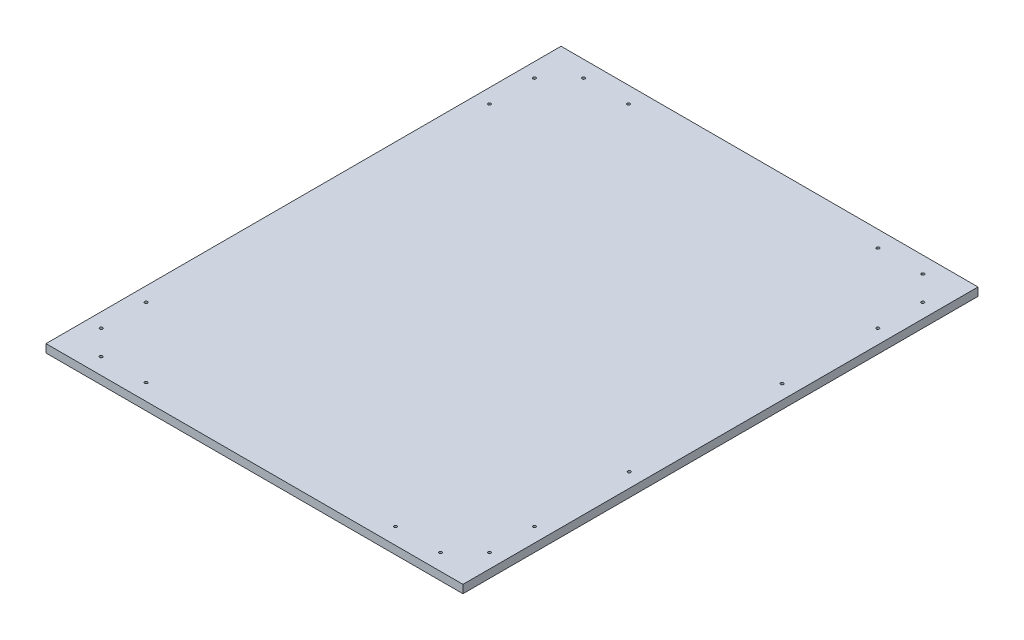
ISO-10303-21;
HEADER;
FILE_DESCRIPTION(('STEP AP214'),'2;1');
FILE_NAME('part.step','',(''),(''),'','','');
FILE_SCHEMA(('AUTOMOTIVE_DESIGN { 1 0 10303 214 1 1 1 1 }'));
ENDSEC;
DATA;
#1=APPLICATION_CONTEXT('core data for automotive mechanical design processes');
#2=APPLICATION_PROTOCOL_DEFINITION('international standard','automotive_design',2000,#1);
#3=PRODUCT_CONTEXT('',#1,'mechanical');
#4=PRODUCT('Part','Part','',(#3));
#5=PRODUCT_RELATED_PRODUCT_CATEGORY('part','',(#4));
#6=PRODUCT_DEFINITION_FORMATION('','',#4);
#7=PRODUCT_DEFINITION_CONTEXT('part definition',#1,'design');
#8=PRODUCT_DEFINITION('design','',#6,#7);
#9=PRODUCT_DEFINITION_SHAPE('','',#8);
#10=(LENGTH_UNIT() NAMED_UNIT(*) SI_UNIT(.MILLI.,.METRE.));
#11=(NAMED_UNIT(*) PLANE_ANGLE_UNIT() SI_UNIT($,.RADIAN.));
#12=(NAMED_UNIT(*) SI_UNIT($,.STERADIAN.) SOLID_ANGLE_UNIT());
#13=UNCERTAINTY_MEASURE_WITH_UNIT(LENGTH_MEASURE(1.E-05),#10,'distance_accuracy_value','');
#14=(GEOMETRIC_REPRESENTATION_CONTEXT(3) GLOBAL_UNCERTAINTY_ASSIGNED_CONTEXT((#13)) GLOBAL_UNIT_ASSIGNED_CONTEXT((#10,
#11,#12)) REPRESENTATION_CONTEXT('',''));
#15=CARTESIAN_POINT('',(0.,0.,0.));
#16=DIRECTION('',(0.,0.,1.));
#17=DIRECTION('',(1.,0.,0.));
#18=AXIS2_PLACEMENT_3D('',#15,#16,#17);
#19=CARTESIAN_POINT('',(0.,10.,0.));
#20=DIRECTION('',(0.,0.,-1.));
#21=DIRECTION('',(-1.,0.,0.));
#22=AXIS2_PLACEMENT_3D('',#19,#20,#21);
#23=PLANE('',#22);
#24=DIRECTION('',(1.,0.,0.));
#25=VECTOR('',#24,1.);
#26=CARTESIAN_POINT('',(0.,0.,0.));
#27=LINE('',#26,#25);
#28=CARTESIAN_POINT('',(0.,0.,0.));
#29=VERTEX_POINT('',#28);
#30=CARTESIAN_POINT('',(510.,0.,0.));
#31=VERTEX_POINT('',#30);
#32=EDGE_CURVE('E116',#29,#31,#27,.T.);
#33=ORIENTED_EDGE('',*,*,#32,.T.);
#34=DIRECTION('',(0.,-1.,0.));
#35=VECTOR('',#34,1.);
#36=CARTESIAN_POINT('',(510.,10.,0.));
#37=LINE('',#36,#35);
#38=CARTESIAN_POINT('',(510.,10.,0.));
#39=VERTEX_POINT('',#38);
#40=EDGE_CURVE('E11',#39,#31,#37,.T.);
#41=ORIENTED_EDGE('',*,*,#40,.F.);
#42=DIRECTION('',(1.,0.,0.));
#43=VECTOR('',#42,1.);
#44=CARTESIAN_POINT('',(0.,10.,0.));
#45=LINE('',#44,#43);
#46=CARTESIAN_POINT('',(0.,10.,0.));
#47=VERTEX_POINT('',#46);
#48=EDGE_CURVE('E99',#47,#39,#45,.T.);
#49=ORIENTED_EDGE('',*,*,#48,.F.);
#50=DIRECTION('',(0.,-1.,0.));
#51=VECTOR('',#50,1.);
#52=CARTESIAN_POINT('',(0.,10.,0.));
#53=LINE('',#52,#51);
#54=EDGE_CURVE('E112',#47,#29,#53,.T.);
#55=ORIENTED_EDGE('',*,*,#54,.T.);
#56=EDGE_LOOP('',(#33,#41,#49,#55));
#57=FACE_BOUND('',#56,.T.);
#58=ADVANCED_FACE('F45',(#57),#23,.F.);
#59=CARTESIAN_POINT('',(510.,10.,0.));
#60=DIRECTION('',(-1.,0.,0.));
#61=DIRECTION('',(0.,0.,1.));
#62=AXIS2_PLACEMENT_3D('',#59,#60,#61);
#63=PLANE('',#62);
#64=DIRECTION('',(0.,0.,-1.));
#65=VECTOR('',#64,1.);
#66=CARTESIAN_POINT('',(510.,0.,0.));
#67=LINE('',#66,#65);
#68=CARTESIAN_POINT('',(510.,0.,-630.));
#69=VERTEX_POINT('',#68);
#70=EDGE_CURVE('E104',#31,#69,#67,.T.);
#71=ORIENTED_EDGE('',*,*,#70,.T.);
#72=DIRECTION('',(0.,-1.,0.));
#73=VECTOR('',#72,1.);
#74=CARTESIAN_POINT('',(510.,10.,-630.));
#75=LINE('',#74,#73);
#76=CARTESIAN_POINT('',(510.,10.,-630.));
#77=VERTEX_POINT('',#76);
#78=EDGE_CURVE('E55',#77,#69,#75,.T.);
#79=ORIENTED_EDGE('',*,*,#78,.F.);
#80=DIRECTION('',(0.,0.,-1.));
#81=VECTOR('',#80,1.);
#82=CARTESIAN_POINT('',(510.,10.,0.));
#83=LINE('',#82,#81);
#84=EDGE_CURVE('E94',#39,#77,#83,.T.);
#85=ORIENTED_EDGE('',*,*,#84,.F.);
#86=ORIENTED_EDGE('',*,*,#40,.T.);
#87=EDGE_LOOP('',(#71,#79,#85,#86));
#88=FACE_BOUND('',#87,.T.);
#89=ADVANCED_FACE('F103',(#88),#63,.F.);
#90=CARTESIAN_POINT('',(510.,10.,-630.));
#91=DIRECTION('',(0.,0.,1.));
#92=DIRECTION('',(1.,0.,0.));
#93=AXIS2_PLACEMENT_3D('',#90,#91,#92);
#94=PLANE('',#93);
#95=DIRECTION('',(-1.,0.,0.));
#96=VECTOR('',#95,1.);
#97=CARTESIAN_POINT('',(510.,0.,-630.));
#98=LINE('',#97,#96);
#99=CARTESIAN_POINT('',(0.,0.,-630.));
#100=VERTEX_POINT('',#99);
#101=EDGE_CURVE('E81',#69,#100,#98,.T.);
#102=ORIENTED_EDGE('',*,*,#101,.T.);
#103=DIRECTION('',(0.,-1.,0.));
#104=VECTOR('',#103,1.);
#105=CARTESIAN_POINT('',(0.,10.,-630.));
#106=LINE('',#105,#104);
#107=CARTESIAN_POINT('',(0.,10.,-630.));
#108=VERTEX_POINT('',#107);
#109=EDGE_CURVE('E106',#108,#100,#106,.T.);
#110=ORIENTED_EDGE('',*,*,#109,.F.);
#111=DIRECTION('',(-1.,0.,0.));
#112=VECTOR('',#111,1.);
#113=CARTESIAN_POINT('',(510.,10.,-630.));
#114=LINE('',#113,#112);
#115=EDGE_CURVE('E97',#77,#108,#114,.T.);
#116=ORIENTED_EDGE('',*,*,#115,.F.);
#117=ORIENTED_EDGE('',*,*,#78,.T.);
#118=EDGE_LOOP('',(#102,#110,#116,#117));
#119=FACE_BOUND('',#118,.T.);
#120=ADVANCED_FACE('F108',(#119),#94,.F.);
#121=CARTESIAN_POINT('',(0.,10.,0.));
#122=DIRECTION('',(1.,0.,0.));
#123=DIRECTION('',(0.,0.,-1.));
#124=AXIS2_PLACEMENT_3D('',#121,#122,#123);
#125=PLANE('',#124);
#126=DIRECTION('',(0.,0.,1.));
#127=VECTOR('',#126,1.);
#128=CARTESIAN_POINT('',(0.,0.,0.));
#129=LINE('',#128,#127);
#130=EDGE_CURVE('E87',#100,#29,#129,.T.);
#131=ORIENTED_EDGE('',*,*,#130,.T.);
#132=ORIENTED_EDGE('',*,*,#54,.F.);
#133=DIRECTION('',(0.,0.,1.));
#134=VECTOR('',#133,1.);
#135=CARTESIAN_POINT('',(0.,10.,0.));
#136=LINE('',#135,#134);
#137=EDGE_CURVE('E64',#108,#47,#136,.T.);
#138=ORIENTED_EDGE('',*,*,#137,.F.);
#139=ORIENTED_EDGE('',*,*,#109,.T.);
#140=EDGE_LOOP('',(#131,#132,#138,#139));
#141=FACE_BOUND('',#140,.T.);
#142=ADVANCED_FACE('F287',(#141),#125,.F.);
#143=CARTESIAN_POINT('',(0.,10.,0.));
#144=DIRECTION('',(0.,1.,0.));
#145=DIRECTION('',(0.,0.,1.));
#146=AXIS2_PLACEMENT_3D('',#143,#144,#145);
#147=PLANE('',#146);
#148=CARTESIAN_POINT('',(102.5,10.,-610.));
#149=DIRECTION('',(0.,1.,0.));
#150=DIRECTION('',(0.,0.,1.));
#151=AXIS2_PLACEMENT_3D('',#148,#149,#150);
#152=CIRCLE('',#151,1.8);
#153=CARTESIAN_POINT('',(102.5,10.,-608.2));
#154=VERTEX_POINT('',#153);
#155=EDGE_CURVE('E252',#154,#154,#152,.T.);
#156=ORIENTED_EDGE('',*,*,#155,.F.);
#157=EDGE_LOOP('',(#156));
#158=FACE_BOUND('',#157,.T.);
#159=CARTESIAN_POINT('',(407.5,10.,-610.));
#160=DIRECTION('',(0.,1.,0.));
#161=DIRECTION('',(0.,0.,1.));
#162=AXIS2_PLACEMENT_3D('',#159,#160,#161);
#163=CIRCLE('',#162,1.80000000000001);
#164=CARTESIAN_POINT('',(407.5,10.,-608.2));
#165=VERTEX_POINT('',#164);
#166=EDGE_CURVE('E262',#165,#165,#163,.T.);
#167=ORIENTED_EDGE('',*,*,#166,.F.);
#168=EDGE_LOOP('',(#167));
#169=FACE_BOUND('',#168,.T.);
#170=CARTESIAN_POINT('',(462.5,10.,-610.));
#171=DIRECTION('',(0.,1.,0.));
#172=DIRECTION('',(0.,0.,1.));
#173=AXIS2_PLACEMENT_3D('',#170,#171,#172);
#174=CIRCLE('',#173,1.80000000000001);
#175=CARTESIAN_POINT('',(462.5,10.,-608.2));
#176=VERTEX_POINT('',#175);
#177=EDGE_CURVE('E257',#176,#176,#174,.T.);
#178=ORIENTED_EDGE('',*,*,#177,.F.);
#179=EDGE_LOOP('',(#178));
#180=FACE_BOUND('',#179,.T.);
#181=CARTESIAN_POINT('',(462.5,10.,-20.));
#182=DIRECTION('',(0.,1.,0.));
#183=DIRECTION('',(0.,0.,1.));
#184=AXIS2_PLACEMENT_3D('',#181,#182,#183);
#185=CIRCLE('',#184,1.80000000000001);
#186=CARTESIAN_POINT('',(462.5,10.,-18.2));
#187=VERTEX_POINT('',#186);
#188=EDGE_CURVE('E253',#187,#187,#185,.T.);
#189=ORIENTED_EDGE('',*,*,#188,.F.);
#190=EDGE_LOOP('',(#189));
#191=FACE_BOUND('',#190,.T.);
#192=CARTESIAN_POINT('',(407.5,10.,-20.));
#193=DIRECTION('',(0.,1.,0.));
#194=DIRECTION('',(0.,0.,1.));
#195=AXIS2_PLACEMENT_3D('',#192,#193,#194);
#196=CIRCLE('',#195,1.80000000000001);
#197=CARTESIAN_POINT('',(407.5,10.,-18.2));
#198=VERTEX_POINT('',#197);
#199=EDGE_CURVE('E258',#198,#198,#196,.T.);
#200=ORIENTED_EDGE('',*,*,#199,.F.);
#201=EDGE_LOOP('',(#200));
#202=FACE_BOUND('',#201,.T.);
#203=CARTESIAN_POINT('',(102.5,10.,-20.));
#204=DIRECTION('',(0.,1.,0.));
#205=DIRECTION('',(0.,0.,1.));
#206=AXIS2_PLACEMENT_3D('',#203,#204,#205);
#207=CIRCLE('',#206,1.79999999999999);
#208=CARTESIAN_POINT('',(102.5,10.,-18.2));
#209=VERTEX_POINT('',#208);
#210=EDGE_CURVE('E273',#209,#209,#207,.T.);
#211=ORIENTED_EDGE('',*,*,#210,.F.);
#212=EDGE_LOOP('',(#211));
#213=FACE_BOUND('',#212,.T.);
#214=CARTESIAN_POINT('',(47.5,10.,-20.));
#215=DIRECTION('',(0.,1.,0.));
#216=DIRECTION('',(0.,0.,1.));
#217=AXIS2_PLACEMENT_3D('',#214,#215,#216);
#218=CIRCLE('',#217,1.79999999999999);
#219=CARTESIAN_POINT('',(47.5,10.,-18.2));
#220=VERTEX_POINT('',#219);
#221=EDGE_CURVE('E269',#220,#220,#218,.T.);
#222=ORIENTED_EDGE('',*,*,#221,.F.);
#223=EDGE_LOOP('',(#222));
#224=FACE_BOUND('',#223,.T.);
#225=CARTESIAN_POINT('',(47.5,10.,-610.));
#226=DIRECTION('',(0.,1.,0.));
#227=DIRECTION('',(0.,0.,1.));
#228=AXIS2_PLACEMENT_3D('',#225,#226,#227);
#229=CIRCLE('',#228,1.8);
#230=CARTESIAN_POINT('',(47.5,10.,-608.2));
#231=VERTEX_POINT('',#230);
#232=EDGE_CURVE('E136',#231,#231,#229,.T.);
#233=ORIENTED_EDGE('',*,*,#232,.F.);
#234=EDGE_LOOP('',(#233));
#235=FACE_BOUND('',#234,.T.);
#236=CARTESIAN_POINT('',(17.5,10.,-50.));
#237=DIRECTION('',(0.,1.,0.));
#238=DIRECTION('',(0.,0.,1.));
#239=AXIS2_PLACEMENT_3D('',#236,#237,#238);
#240=CIRCLE('',#239,1.8);
#241=CARTESIAN_POINT('',(17.5,10.,-48.2));
#242=VERTEX_POINT('',#241);
#243=EDGE_CURVE('E228',#242,#242,#240,.T.);
#244=ORIENTED_EDGE('',*,*,#243,.F.);
#245=EDGE_LOOP('',(#244));
#246=FACE_BOUND('',#245,.T.);
#247=CARTESIAN_POINT('',(17.5,10.,-105.));
#248=DIRECTION('',(0.,1.,0.));
#249=DIRECTION('',(0.,0.,1.));
#250=AXIS2_PLACEMENT_3D('',#247,#248,#249);
#251=CIRCLE('',#250,1.8);
#252=CARTESIAN_POINT('',(17.5,10.,-103.2));
#253=VERTEX_POINT('',#252);
#254=EDGE_CURVE('E232',#253,#253,#251,.T.);
#255=ORIENTED_EDGE('',*,*,#254,.F.);
#256=EDGE_LOOP('',(#255));
#257=FACE_BOUND('',#256,.T.);
#258=CARTESIAN_POINT('',(17.5,10.,-525.));
#259=DIRECTION('',(0.,1.,0.));
#260=DIRECTION('',(0.,0.,1.));
#261=AXIS2_PLACEMENT_3D('',#258,#259,#260);
#262=CIRCLE('',#261,1.80000000000002);
#263=CARTESIAN_POINT('',(17.5,10.,-523.2));
#264=VERTEX_POINT('',#263);
#265=EDGE_CURVE('E240',#264,#264,#262,.T.);
#266=ORIENTED_EDGE('',*,*,#265,.F.);
#267=EDGE_LOOP('',(#266));
#268=FACE_BOUND('',#267,.T.);
#269=CARTESIAN_POINT('',(17.5,10.,-580.));
#270=DIRECTION('',(0.,1.,0.));
#271=DIRECTION('',(0.,0.,1.));
#272=AXIS2_PLACEMENT_3D('',#269,#270,#271);
#273=CIRCLE('',#272,1.80000000000001);
#274=CARTESIAN_POINT('',(17.5,10.,-578.2));
#275=VERTEX_POINT('',#274);
#276=EDGE_CURVE('E167',#275,#275,#273,.T.);
#277=ORIENTED_EDGE('',*,*,#276,.F.);
#278=EDGE_LOOP('',(#277));
#279=FACE_BOUND('',#278,.T.);
#280=CARTESIAN_POINT('',(492.5,10.,-50.));
#281=DIRECTION('',(0.,1.,0.));
#282=DIRECTION('',(0.,0.,1.));
#283=AXIS2_PLACEMENT_3D('',#280,#281,#282);
#284=CIRCLE('',#283,1.80000000000001);
#285=CARTESIAN_POINT('',(492.5,10.,-48.2));
#286=VERTEX_POINT('',#285);
#287=EDGE_CURVE('E180',#286,#286,#284,.T.);
#288=ORIENTED_EDGE('',*,*,#287,.F.);
#289=EDGE_LOOP('',(#288));
#290=FACE_BOUND('',#289,.T.);
#291=CARTESIAN_POINT('',(492.5,10.,-221.));
#292=DIRECTION('',(0.,1.,0.));
#293=DIRECTION('',(0.,0.,1.));
#294=AXIS2_PLACEMENT_3D('',#291,#292,#293);
#295=CIRCLE('',#294,1.80000000000001);
#296=CARTESIAN_POINT('',(492.5,10.,-219.2));
#297=VERTEX_POINT('',#296);
#298=EDGE_CURVE('E185',#297,#297,#295,.T.);
#299=ORIENTED_EDGE('',*,*,#298,.F.);
#300=EDGE_LOOP('',(#299));
#301=FACE_BOUND('',#300,.T.);
#302=CARTESIAN_POINT('',(492.5,10.,-105.));
#303=DIRECTION('',(0.,1.,0.));
#304=DIRECTION('',(0.,0.,1.));
#305=AXIS2_PLACEMENT_3D('',#302,#303,#304);
#306=CIRCLE('',#305,1.80000000000001);
#307=CARTESIAN_POINT('',(492.5,10.,-103.2));
#308=VERTEX_POINT('',#307);
#309=EDGE_CURVE('E184',#308,#308,#306,.T.);
#310=ORIENTED_EDGE('',*,*,#309,.F.);
#311=EDGE_LOOP('',(#310));
#312=FACE_BOUND('',#311,.T.);
#313=CARTESIAN_POINT('',(492.5,10.,-580.));
#314=DIRECTION('',(0.,1.,0.));
#315=DIRECTION('',(0.,0.,1.));
#316=AXIS2_PLACEMENT_3D('',#313,#314,#315);
#317=CIRCLE('',#316,1.80000000000001);
#318=CARTESIAN_POINT('',(492.5,10.,-578.2));
#319=VERTEX_POINT('',#318);
#320=EDGE_CURVE('E218',#319,#319,#317,.T.);
#321=ORIENTED_EDGE('',*,*,#320,.F.);
#322=EDGE_LOOP('',(#321));
#323=FACE_BOUND('',#322,.T.);
#324=CARTESIAN_POINT('',(492.5,10.,-525.));
#325=DIRECTION('',(0.,1.,0.));
#326=DIRECTION('',(0.,0.,1.));
#327=AXIS2_PLACEMENT_3D('',#324,#325,#326);
#328=CIRCLE('',#327,1.80000000000001);
#329=CARTESIAN_POINT('',(492.5,10.,-523.2));
#330=VERTEX_POINT('',#329);
#331=EDGE_CURVE('E195',#330,#330,#328,.T.);
#332=ORIENTED_EDGE('',*,*,#331,.F.);
#333=EDGE_LOOP('',(#332));
#334=FACE_BOUND('',#333,.T.);
#335=CARTESIAN_POINT('',(492.5,10.,-407.828802921746));
#336=DIRECTION('',(0.,1.,0.));
#337=DIRECTION('',(0.,0.,1.));
#338=AXIS2_PLACEMENT_3D('',#335,#336,#337);
#339=CIRCLE('',#338,1.80000000000001);
#340=CARTESIAN_POINT('',(492.5,10.,-406.028802921746));
#341=VERTEX_POINT('',#340);
#342=EDGE_CURVE('E204',#341,#341,#339,.T.);
#343=ORIENTED_EDGE('',*,*,#342,.F.);
#344=EDGE_LOOP('',(#343));
#345=FACE_BOUND('',#344,.T.);
#346=ORIENTED_EDGE('',*,*,#48,.T.);
#347=ORIENTED_EDGE('',*,*,#84,.T.);
#348=ORIENTED_EDGE('',*,*,#115,.T.);
#349=ORIENTED_EDGE('',*,*,#137,.T.);
#350=EDGE_LOOP('',(#346,#347,#348,#349));
#351=FACE_BOUND('',#350,.T.);
#352=ADVANCED_FACE('F95',(#158,#169,#180,#191,#202,#213,#224,#235,#246,#257,#268,#279,#290,#301,
#312,#323,#334,#345,#351),#147,.T.);
#353=CARTESIAN_POINT('',(0.,0.,0.));
#354=DIRECTION('',(0.,1.,0.));
#355=DIRECTION('',(0.,0.,1.));
#356=AXIS2_PLACEMENT_3D('',#353,#354,#355);
#357=PLANE('',#356);
#358=CARTESIAN_POINT('',(102.5,0.,-610.));
#359=DIRECTION('',(0.,1.,0.));
#360=DIRECTION('',(0.,0.,1.));
#361=AXIS2_PLACEMENT_3D('',#358,#359,#360);
#362=CIRCLE('',#361,1.8);
#363=CARTESIAN_POINT('',(102.5,0.,-608.2));
#364=VERTEX_POINT('',#363);
#365=EDGE_CURVE('E48',#364,#364,#362,.T.);
#366=ORIENTED_EDGE('',*,*,#365,.T.);
#367=EDGE_LOOP('',(#366));
#368=FACE_BOUND('',#367,.T.);
#369=CARTESIAN_POINT('',(407.5,0.,-610.));
#370=DIRECTION('',(0.,1.,0.));
#371=DIRECTION('',(0.,0.,1.));
#372=AXIS2_PLACEMENT_3D('',#369,#370,#371);
#373=CIRCLE('',#372,1.80000000000001);
#374=CARTESIAN_POINT('',(407.5,0.,-608.2));
#375=VERTEX_POINT('',#374);
#376=EDGE_CURVE('E155',#375,#375,#373,.T.);
#377=ORIENTED_EDGE('',*,*,#376,.T.);
#378=EDGE_LOOP('',(#377));
#379=FACE_BOUND('',#378,.T.);
#380=CARTESIAN_POINT('',(462.5,0.,-610.));
#381=DIRECTION('',(0.,1.,0.));
#382=DIRECTION('',(0.,0.,1.));
#383=AXIS2_PLACEMENT_3D('',#380,#381,#382);
#384=CIRCLE('',#383,1.80000000000001);
#385=CARTESIAN_POINT('',(462.5,0.,-608.2));
#386=VERTEX_POINT('',#385);
#387=EDGE_CURVE('E152',#386,#386,#384,.T.);
#388=ORIENTED_EDGE('',*,*,#387,.T.);
#389=EDGE_LOOP('',(#388));
#390=FACE_BOUND('',#389,.T.);
#391=CARTESIAN_POINT('',(462.5,0.,-20.));
#392=DIRECTION('',(0.,1.,0.));
#393=DIRECTION('',(0.,0.,1.));
#394=AXIS2_PLACEMENT_3D('',#391,#392,#393);
#395=CIRCLE('',#394,1.80000000000001);
#396=CARTESIAN_POINT('',(462.5,0.,-18.2));
#397=VERTEX_POINT('',#396);
#398=EDGE_CURVE('E148',#397,#397,#395,.T.);
#399=ORIENTED_EDGE('',*,*,#398,.T.);
#400=EDGE_LOOP('',(#399));
#401=FACE_BOUND('',#400,.T.);
#402=CARTESIAN_POINT('',(407.5,0.,-20.));
#403=DIRECTION('',(0.,1.,0.));
#404=DIRECTION('',(0.,0.,1.));
#405=AXIS2_PLACEMENT_3D('',#402,#403,#404);
#406=CIRCLE('',#405,1.80000000000001);
#407=CARTESIAN_POINT('',(407.5,0.,-18.2));
#408=VERTEX_POINT('',#407);
#409=EDGE_CURVE('E144',#408,#408,#406,.T.);
#410=ORIENTED_EDGE('',*,*,#409,.T.);
#411=EDGE_LOOP('',(#410));
#412=FACE_BOUND('',#411,.T.);
#413=CARTESIAN_POINT('',(102.5,0.,-20.));
#414=DIRECTION('',(0.,1.,0.));
#415=DIRECTION('',(0.,0.,1.));
#416=AXIS2_PLACEMENT_3D('',#413,#414,#415);
#417=CIRCLE('',#416,1.79999999999999);
#418=CARTESIAN_POINT('',(102.5,0.,-18.2));
#419=VERTEX_POINT('',#418);
#420=EDGE_CURVE('E140',#419,#419,#417,.T.);
#421=ORIENTED_EDGE('',*,*,#420,.T.);
#422=EDGE_LOOP('',(#421));
#423=FACE_BOUND('',#422,.T.);
#424=CARTESIAN_POINT('',(47.5,0.,-20.));
#425=DIRECTION('',(0.,1.,0.));
#426=DIRECTION('',(0.,0.,1.));
#427=AXIS2_PLACEMENT_3D('',#424,#425,#426);
#428=CIRCLE('',#427,1.79999999999999);
#429=CARTESIAN_POINT('',(47.5,0.,-18.2));
#430=VERTEX_POINT('',#429);
#431=EDGE_CURVE('E135',#430,#430,#428,.T.);
#432=ORIENTED_EDGE('',*,*,#431,.T.);
#433=EDGE_LOOP('',(#432));
#434=FACE_BOUND('',#433,.T.);
#435=CARTESIAN_POINT('',(47.5,0.,-610.));
#436=DIRECTION('',(0.,1.,0.));
#437=DIRECTION('',(0.,0.,1.));
#438=AXIS2_PLACEMENT_3D('',#435,#436,#437);
#439=CIRCLE('',#438,1.8);
#440=CARTESIAN_POINT('',(47.5,0.,-608.2));
#441=VERTEX_POINT('',#440);
#442=EDGE_CURVE('E131',#441,#441,#439,.T.);
#443=ORIENTED_EDGE('',*,*,#442,.T.);
#444=EDGE_LOOP('',(#443));
#445=FACE_BOUND('',#444,.T.);
#446=CARTESIAN_POINT('',(17.5,0.,-50.));
#447=DIRECTION('',(0.,1.,0.));
#448=DIRECTION('',(0.,0.,1.));
#449=AXIS2_PLACEMENT_3D('',#446,#447,#448);
#450=CIRCLE('',#449,1.8);
#451=CARTESIAN_POINT('',(17.5,0.,-48.2));
#452=VERTEX_POINT('',#451);
#453=EDGE_CURVE('E194',#452,#452,#450,.T.);
#454=ORIENTED_EDGE('',*,*,#453,.T.);
#455=EDGE_LOOP('',(#454));
#456=FACE_BOUND('',#455,.T.);
#457=CARTESIAN_POINT('',(17.5,0.,-105.));
#458=DIRECTION('',(0.,1.,0.));
#459=DIRECTION('',(0.,0.,1.));
#460=AXIS2_PLACEMENT_3D('',#457,#458,#459);
#461=CIRCLE('',#460,1.8);
#462=CARTESIAN_POINT('',(17.5,0.,-103.2));
#463=VERTEX_POINT('',#462);
#464=EDGE_CURVE('E236',#463,#463,#461,.T.);
#465=ORIENTED_EDGE('',*,*,#464,.T.);
#466=EDGE_LOOP('',(#465));
#467=FACE_BOUND('',#466,.T.);
#468=CARTESIAN_POINT('',(17.5,0.,-525.));
#469=DIRECTION('',(0.,1.,0.));
#470=DIRECTION('',(0.,0.,1.));
#471=AXIS2_PLACEMENT_3D('',#468,#469,#470);
#472=CIRCLE('',#471,1.80000000000002);
#473=CARTESIAN_POINT('',(17.5,0.,-523.2));
#474=VERTEX_POINT('',#473);
#475=EDGE_CURVE('E173',#474,#474,#472,.T.);
#476=ORIENTED_EDGE('',*,*,#475,.T.);
#477=EDGE_LOOP('',(#476));
#478=FACE_BOUND('',#477,.T.);
#479=CARTESIAN_POINT('',(17.5,0.,-580.));
#480=DIRECTION('',(0.,1.,0.));
#481=DIRECTION('',(0.,0.,1.));
#482=AXIS2_PLACEMENT_3D('',#479,#480,#481);
#483=CIRCLE('',#482,1.80000000000001);
#484=CARTESIAN_POINT('',(17.5,0.,-578.2));
#485=VERTEX_POINT('',#484);
#486=EDGE_CURVE('E162',#485,#485,#483,.T.);
#487=ORIENTED_EDGE('',*,*,#486,.T.);
#488=EDGE_LOOP('',(#487));
#489=FACE_BOUND('',#488,.T.);
#490=CARTESIAN_POINT('',(492.5,0.,-50.));
#491=DIRECTION('',(0.,1.,0.));
#492=DIRECTION('',(0.,0.,1.));
#493=AXIS2_PLACEMENT_3D('',#490,#491,#492);
#494=CIRCLE('',#493,1.80000000000001);
#495=CARTESIAN_POINT('',(492.5,0.,-48.2));
#496=VERTEX_POINT('',#495);
#497=EDGE_CURVE('E120',#496,#496,#494,.T.);
#498=ORIENTED_EDGE('',*,*,#497,.T.);
#499=EDGE_LOOP('',(#498));
#500=FACE_BOUND('',#499,.T.);
#501=CARTESIAN_POINT('',(492.5,0.,-221.));
#502=DIRECTION('',(0.,1.,0.));
#503=DIRECTION('',(0.,0.,1.));
#504=AXIS2_PLACEMENT_3D('',#501,#502,#503);
#505=CIRCLE('',#504,1.80000000000001);
#506=CARTESIAN_POINT('',(492.5,0.,-219.2));
#507=VERTEX_POINT('',#506);
#508=EDGE_CURVE('E190',#507,#507,#505,.T.);
#509=ORIENTED_EDGE('',*,*,#508,.T.);
#510=EDGE_LOOP('',(#509));
#511=FACE_BOUND('',#510,.T.);
#512=CARTESIAN_POINT('',(492.5,0.,-105.));
#513=DIRECTION('',(0.,1.,0.));
#514=DIRECTION('',(0.,0.,1.));
#515=AXIS2_PLACEMENT_3D('',#512,#513,#514);
#516=CIRCLE('',#515,1.80000000000001);
#517=CARTESIAN_POINT('',(492.5,0.,-103.2));
#518=VERTEX_POINT('',#517);
#519=EDGE_CURVE('E214',#518,#518,#516,.T.);
#520=ORIENTED_EDGE('',*,*,#519,.T.);
#521=EDGE_LOOP('',(#520));
#522=FACE_BOUND('',#521,.T.);
#523=CARTESIAN_POINT('',(492.5,0.,-580.));
#524=DIRECTION('',(0.,1.,0.));
#525=DIRECTION('',(0.,0.,1.));
#526=AXIS2_PLACEMENT_3D('',#523,#524,#525);
#527=CIRCLE('',#526,1.80000000000001);
#528=CARTESIAN_POINT('',(492.5,0.,-578.2));
#529=VERTEX_POINT('',#528);
#530=EDGE_CURVE('E199',#529,#529,#527,.T.);
#531=ORIENTED_EDGE('',*,*,#530,.T.);
#532=EDGE_LOOP('',(#531));
#533=FACE_BOUND('',#532,.T.);
#534=CARTESIAN_POINT('',(492.5,0.,-525.));
#535=DIRECTION('',(0.,1.,0.));
#536=DIRECTION('',(0.,0.,1.));
#537=AXIS2_PLACEMENT_3D('',#534,#535,#536);
#538=CIRCLE('',#537,1.80000000000001);
#539=CARTESIAN_POINT('',(492.5,0.,-523.2));
#540=VERTEX_POINT('',#539);
#541=EDGE_CURVE('E200',#540,#540,#538,.T.);
#542=ORIENTED_EDGE('',*,*,#541,.T.);
#543=EDGE_LOOP('',(#542));
#544=FACE_BOUND('',#543,.T.);
#545=CARTESIAN_POINT('',(492.5,0.,-407.828802921746));
#546=DIRECTION('',(0.,1.,0.));
#547=DIRECTION('',(0.,0.,1.));
#548=AXIS2_PLACEMENT_3D('',#545,#546,#547);
#549=CIRCLE('',#548,1.80000000000001);
#550=CARTESIAN_POINT('',(492.5,0.,-406.028802921746));
#551=VERTEX_POINT('',#550);
#552=EDGE_CURVE('E189',#551,#551,#549,.T.);
#553=ORIENTED_EDGE('',*,*,#552,.T.);
#554=EDGE_LOOP('',(#553));
#555=FACE_BOUND('',#554,.T.);
#556=ORIENTED_EDGE('',*,*,#32,.F.);
#557=ORIENTED_EDGE('',*,*,#130,.F.);
#558=ORIENTED_EDGE('',*,*,#101,.F.);
#559=ORIENTED_EDGE('',*,*,#70,.F.);
#560=EDGE_LOOP('',(#556,#557,#558,#559));
#561=FACE_BOUND('',#560,.T.);
#562=ADVANCED_FACE('F286',(#368,#379,#390,#401,#412,#423,#434,#445,#456,#467,#478,#489,#500,
#511,#522,#533,#544,#555,#561),#357,.F.);
#563=CARTESIAN_POINT('',(492.5,0.,-407.828802921746));
#564=DIRECTION('',(0.,1.,0.));
#565=DIRECTION('',(0.,0.,1.));
#566=AXIS2_PLACEMENT_3D('',#563,#564,#565);
#567=CYLINDRICAL_SURFACE('',#566,1.80000000000001);
#568=ORIENTED_EDGE('',*,*,#552,.F.);
#569=EDGE_LOOP('',(#568));
#570=FACE_BOUND('',#569,.T.);
#571=ORIENTED_EDGE('',*,*,#342,.T.);
#572=EDGE_LOOP('',(#571));
#573=FACE_BOUND('',#572,.T.);
#574=ADVANCED_FACE('F316',(#570,#573),#567,.F.);
#575=CARTESIAN_POINT('',(492.5,0.,-525.));
#576=DIRECTION('',(0.,1.,0.));
#577=DIRECTION('',(0.,0.,1.));
#578=AXIS2_PLACEMENT_3D('',#575,#576,#577);
#579=CYLINDRICAL_SURFACE('',#578,1.80000000000001);
#580=ORIENTED_EDGE('',*,*,#541,.F.);
#581=EDGE_LOOP('',(#580));
#582=FACE_BOUND('',#581,.T.);
#583=ORIENTED_EDGE('',*,*,#331,.T.);
#584=EDGE_LOOP('',(#583));
#585=FACE_BOUND('',#584,.T.);
#586=ADVANCED_FACE('F318',(#582,#585),#579,.F.);
#587=CARTESIAN_POINT('',(492.5,0.,-580.));
#588=DIRECTION('',(0.,1.,0.));
#589=DIRECTION('',(0.,0.,1.));
#590=AXIS2_PLACEMENT_3D('',#587,#588,#589);
#591=CYLINDRICAL_SURFACE('',#590,1.80000000000001);
#592=ORIENTED_EDGE('',*,*,#530,.F.);
#593=EDGE_LOOP('',(#592));
#594=FACE_BOUND('',#593,.T.);
#595=ORIENTED_EDGE('',*,*,#320,.T.);
#596=EDGE_LOOP('',(#595));
#597=FACE_BOUND('',#596,.T.);
#598=ADVANCED_FACE('F325',(#594,#597),#591,.F.);
#599=CARTESIAN_POINT('',(492.5,0.,-105.));
#600=DIRECTION('',(0.,1.,0.));
#601=DIRECTION('',(0.,0.,1.));
#602=AXIS2_PLACEMENT_3D('',#599,#600,#601);
#603=CYLINDRICAL_SURFACE('',#602,1.80000000000001);
#604=ORIENTED_EDGE('',*,*,#519,.F.);
#605=EDGE_LOOP('',(#604));
#606=FACE_BOUND('',#605,.T.);
#607=ORIENTED_EDGE('',*,*,#309,.T.);
#608=EDGE_LOOP('',(#607));
#609=FACE_BOUND('',#608,.T.);
#610=ADVANCED_FACE('F346',(#606,#609),#603,.F.);
#611=CARTESIAN_POINT('',(492.5,0.,-221.));
#612=DIRECTION('',(0.,1.,0.));
#613=DIRECTION('',(0.,0.,1.));
#614=AXIS2_PLACEMENT_3D('',#611,#612,#613);
#615=CYLINDRICAL_SURFACE('',#614,1.80000000000001);
#616=ORIENTED_EDGE('',*,*,#508,.F.);
#617=EDGE_LOOP('',(#616));
#618=FACE_BOUND('',#617,.T.);
#619=ORIENTED_EDGE('',*,*,#298,.T.);
#620=EDGE_LOOP('',(#619));
#621=FACE_BOUND('',#620,.T.);
#622=ADVANCED_FACE('F349',(#618,#621),#615,.F.);
#623=CARTESIAN_POINT('',(492.5,0.,-50.));
#624=DIRECTION('',(0.,1.,0.));
#625=DIRECTION('',(0.,0.,1.));
#626=AXIS2_PLACEMENT_3D('',#623,#624,#625);
#627=CYLINDRICAL_SURFACE('',#626,1.80000000000001);
#628=ORIENTED_EDGE('',*,*,#497,.F.);
#629=EDGE_LOOP('',(#628));
#630=FACE_BOUND('',#629,.T.);
#631=ORIENTED_EDGE('',*,*,#287,.T.);
#632=EDGE_LOOP('',(#631));
#633=FACE_BOUND('',#632,.T.);
#634=ADVANCED_FACE('F354',(#630,#633),#627,.F.);
#635=CARTESIAN_POINT('',(17.5,0.,-580.));
#636=DIRECTION('',(0.,1.,0.));
#637=DIRECTION('',(0.,0.,1.));
#638=AXIS2_PLACEMENT_3D('',#635,#636,#637);
#639=CYLINDRICAL_SURFACE('',#638,1.80000000000001);
#640=ORIENTED_EDGE('',*,*,#486,.F.);
#641=EDGE_LOOP('',(#640));
#642=FACE_BOUND('',#641,.T.);
#643=ORIENTED_EDGE('',*,*,#276,.T.);
#644=EDGE_LOOP('',(#643));
#645=FACE_BOUND('',#644,.T.);
#646=ADVANCED_FACE('F370',(#642,#645),#639,.F.);
#647=CARTESIAN_POINT('',(17.5,0.,-525.));
#648=DIRECTION('',(0.,1.,0.));
#649=DIRECTION('',(0.,0.,1.));
#650=AXIS2_PLACEMENT_3D('',#647,#648,#649);
#651=CYLINDRICAL_SURFACE('',#650,1.80000000000002);
#652=ORIENTED_EDGE('',*,*,#475,.F.);
#653=EDGE_LOOP('',(#652));
#654=FACE_BOUND('',#653,.T.);
#655=ORIENTED_EDGE('',*,*,#265,.T.);
#656=EDGE_LOOP('',(#655));
#657=FACE_BOUND('',#656,.T.);
#658=ADVANCED_FACE('F378',(#654,#657),#651,.F.);
#659=CARTESIAN_POINT('',(17.5,0.,-105.));
#660=DIRECTION('',(0.,1.,0.));
#661=DIRECTION('',(0.,0.,1.));
#662=AXIS2_PLACEMENT_3D('',#659,#660,#661);
#663=CYLINDRICAL_SURFACE('',#662,1.8);
#664=ORIENTED_EDGE('',*,*,#464,.F.);
#665=EDGE_LOOP('',(#664));
#666=FACE_BOUND('',#665,.T.);
#667=ORIENTED_EDGE('',*,*,#254,.T.);
#668=EDGE_LOOP('',(#667));
#669=FACE_BOUND('',#668,.T.);
#670=ADVANCED_FACE('F382',(#666,#669),#663,.F.);
#671=CARTESIAN_POINT('',(17.5,0.,-50.));
#672=DIRECTION('',(0.,1.,0.));
#673=DIRECTION('',(0.,0.,1.));
#674=AXIS2_PLACEMENT_3D('',#671,#672,#673);
#675=CYLINDRICAL_SURFACE('',#674,1.8);
#676=ORIENTED_EDGE('',*,*,#453,.F.);
#677=EDGE_LOOP('',(#676));
#678=FACE_BOUND('',#677,.T.);
#679=ORIENTED_EDGE('',*,*,#243,.T.);
#680=EDGE_LOOP('',(#679));
#681=FACE_BOUND('',#680,.T.);
#682=ADVANCED_FACE('F386',(#678,#681),#675,.F.);
#683=CARTESIAN_POINT('',(47.5,-2.1,-610.));
#684=DIRECTION('',(0.,1.,0.));
#685=DIRECTION('',(0.,0.,1.));
#686=AXIS2_PLACEMENT_3D('',#683,#684,#685);
#687=CYLINDRICAL_SURFACE('',#686,1.8);
#688=ORIENTED_EDGE('',*,*,#232,.T.);
#689=EDGE_LOOP('',(#688));
#690=FACE_BOUND('',#689,.T.);
#691=ORIENTED_EDGE('',*,*,#442,.F.);
#692=EDGE_LOOP('',(#691));
#693=FACE_BOUND('',#692,.T.);
#694=ADVANCED_FACE('F390',(#690,#693),#687,.F.);
#695=CARTESIAN_POINT('',(47.5,-2.1,-20.));
#696=DIRECTION('',(0.,1.,0.));
#697=DIRECTION('',(0.,0.,1.));
#698=AXIS2_PLACEMENT_3D('',#695,#696,#697);
#699=CYLINDRICAL_SURFACE('',#698,1.79999999999999);
#700=ORIENTED_EDGE('',*,*,#221,.T.);
#701=EDGE_LOOP('',(#700));
#702=FACE_BOUND('',#701,.T.);
#703=ORIENTED_EDGE('',*,*,#431,.F.);
#704=EDGE_LOOP('',(#703));
#705=FACE_BOUND('',#704,.T.);
#706=ADVANCED_FACE('F394',(#702,#705),#699,.F.);
#707=CARTESIAN_POINT('',(102.5,-2.1,-20.));
#708=DIRECTION('',(0.,1.,0.));
#709=DIRECTION('',(0.,0.,1.));
#710=AXIS2_PLACEMENT_3D('',#707,#708,#709);
#711=CYLINDRICAL_SURFACE('',#710,1.79999999999999);
#712=ORIENTED_EDGE('',*,*,#210,.T.);
#713=EDGE_LOOP('',(#712));
#714=FACE_BOUND('',#713,.T.);
#715=ORIENTED_EDGE('',*,*,#420,.F.);
#716=EDGE_LOOP('',(#715));
#717=FACE_BOUND('',#716,.T.);
#718=ADVANCED_FACE('F414',(#714,#717),#711,.F.);
#719=CARTESIAN_POINT('',(407.5,-2.1,-20.));
#720=DIRECTION('',(0.,1.,0.));
#721=DIRECTION('',(0.,0.,1.));
#722=AXIS2_PLACEMENT_3D('',#719,#720,#721);
#723=CYLINDRICAL_SURFACE('',#722,1.80000000000001);
#724=ORIENTED_EDGE('',*,*,#199,.T.);
#725=EDGE_LOOP('',(#724));
#726=FACE_BOUND('',#725,.T.);
#727=ORIENTED_EDGE('',*,*,#409,.F.);
#728=EDGE_LOOP('',(#727));
#729=FACE_BOUND('',#728,.T.);
#730=ADVANCED_FACE('F281',(#726,#729),#723,.F.);
#731=CARTESIAN_POINT('',(462.5,-2.1,-20.));
#732=DIRECTION('',(0.,1.,0.));
#733=DIRECTION('',(0.,0.,1.));
#734=AXIS2_PLACEMENT_3D('',#731,#732,#733);
#735=CYLINDRICAL_SURFACE('',#734,1.80000000000001);
#736=ORIENTED_EDGE('',*,*,#188,.T.);
#737=EDGE_LOOP('',(#736));
#738=FACE_BOUND('',#737,.T.);
#739=ORIENTED_EDGE('',*,*,#398,.F.);
#740=EDGE_LOOP('',(#739));
#741=FACE_BOUND('',#740,.T.);
#742=ADVANCED_FACE('F396',(#738,#741),#735,.F.);
#743=CARTESIAN_POINT('',(462.5,-2.1,-610.));
#744=DIRECTION('',(0.,1.,0.));
#745=DIRECTION('',(0.,0.,1.));
#746=AXIS2_PLACEMENT_3D('',#743,#744,#745);
#747=CYLINDRICAL_SURFACE('',#746,1.80000000000001);
#748=ORIENTED_EDGE('',*,*,#177,.T.);
#749=EDGE_LOOP('',(#748));
#750=FACE_BOUND('',#749,.T.);
#751=ORIENTED_EDGE('',*,*,#387,.F.);
#752=EDGE_LOOP('',(#751));
#753=FACE_BOUND('',#752,.T.);
#754=ADVANCED_FACE('F399',(#750,#753),#747,.F.);
#755=CARTESIAN_POINT('',(407.5,-2.1,-610.));
#756=DIRECTION('',(0.,1.,0.));
#757=DIRECTION('',(0.,0.,1.));
#758=AXIS2_PLACEMENT_3D('',#755,#756,#757);
#759=CYLINDRICAL_SURFACE('',#758,1.80000000000001);
#760=ORIENTED_EDGE('',*,*,#166,.T.);
#761=EDGE_LOOP('',(#760));
#762=FACE_BOUND('',#761,.T.);
#763=ORIENTED_EDGE('',*,*,#376,.F.);
#764=EDGE_LOOP('',(#763));
#765=FACE_BOUND('',#764,.T.);
#766=ADVANCED_FACE('F403',(#762,#765),#759,.F.);
#767=CARTESIAN_POINT('',(102.5,-2.1,-610.));
#768=DIRECTION('',(0.,1.,0.));
#769=DIRECTION('',(0.,0.,1.));
#770=AXIS2_PLACEMENT_3D('',#767,#768,#769);
#771=CYLINDRICAL_SURFACE('',#770,1.8);
#772=ORIENTED_EDGE('',*,*,#155,.T.);
#773=EDGE_LOOP('',(#772));
#774=FACE_BOUND('',#773,.T.);
#775=ORIENTED_EDGE('',*,*,#365,.F.);
#776=EDGE_LOOP('',(#775));
#777=FACE_BOUND('',#776,.T.);
#778=ADVANCED_FACE('F407',(#774,#777),#771,.F.);
#779=CLOSED_SHELL('',(#58,#89,#120,#142,#352,#562,#574,#586,#598,#610,#622,#634,#646,#658,#670,
#682,#694,#706,#718,#730,#742,#754,#766,#778));
#780=MANIFOLD_SOLID_BREP('B2',#779);
#781=ADVANCED_BREP_SHAPE_REPRESENTATION('',(#18,#780),#14);
#782=SHAPE_DEFINITION_REPRESENTATION(#9,#781);
ENDSEC;
END-ISO-10303-21;
